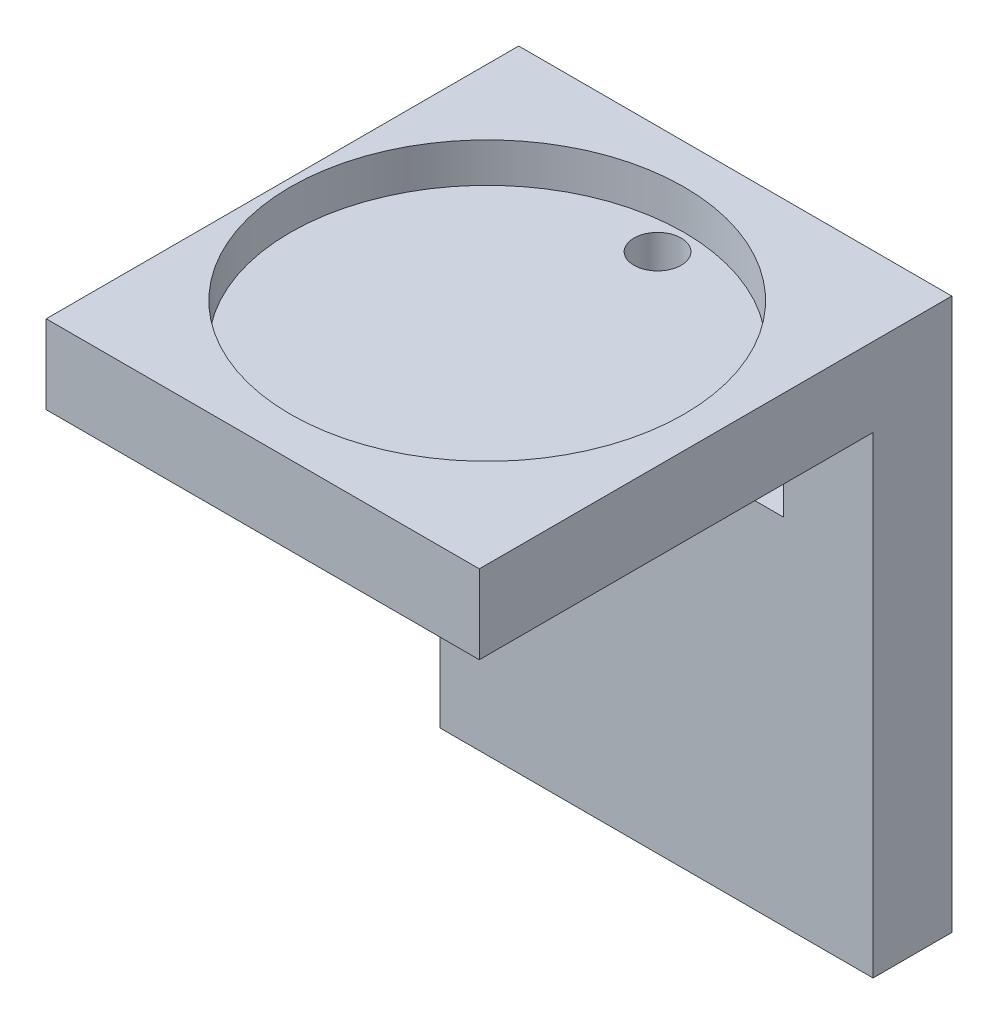
ISO-10303-21;
HEADER;
FILE_DESCRIPTION(('STEP AP214'),'2;1');
FILE_NAME('part.step','',(''),(''),'','','');
FILE_SCHEMA(('AUTOMOTIVE_DESIGN { 1 0 10303 214 1 1 1 1 }'));
ENDSEC;
DATA;
#1=APPLICATION_CONTEXT('core data for automotive mechanical design processes');
#2=APPLICATION_PROTOCOL_DEFINITION('international standard','automotive_design',2000,#1);
#3=PRODUCT_CONTEXT('',#1,'mechanical');
#4=PRODUCT('Part','Part','',(#3));
#5=PRODUCT_RELATED_PRODUCT_CATEGORY('part','',(#4));
#6=PRODUCT_DEFINITION_FORMATION('','',#4);
#7=PRODUCT_DEFINITION_CONTEXT('part definition',#1,'design');
#8=PRODUCT_DEFINITION('design','',#6,#7);
#9=PRODUCT_DEFINITION_SHAPE('','',#8);
#10=(LENGTH_UNIT() NAMED_UNIT(*) SI_UNIT(.MILLI.,.METRE.));
#11=(NAMED_UNIT(*) PLANE_ANGLE_UNIT() SI_UNIT($,.RADIAN.));
#12=(NAMED_UNIT(*) SI_UNIT($,.STERADIAN.) SOLID_ANGLE_UNIT());
#13=UNCERTAINTY_MEASURE_WITH_UNIT(LENGTH_MEASURE(1.E-05),#10,'distance_accuracy_value','');
#14=(GEOMETRIC_REPRESENTATION_CONTEXT(3) GLOBAL_UNCERTAINTY_ASSIGNED_CONTEXT((#13)) GLOBAL_UNIT_ASSIGNED_CONTEXT((#10,
#11,#12)) REPRESENTATION_CONTEXT('',''));
#15=CARTESIAN_POINT('',(0.,0.,0.));
#16=DIRECTION('',(0.,0.,1.));
#17=DIRECTION('',(1.,0.,0.));
#18=AXIS2_PLACEMENT_3D('',#15,#16,#17);
#19=CARTESIAN_POINT('',(0.,530.,0.));
#20=DIRECTION('',(0.,0.,-1.));
#21=DIRECTION('',(-1.,0.,0.));
#22=AXIS2_PLACEMENT_3D('',#19,#20,#21);
#23=PLANE('',#22);
#24=DIRECTION('',(-1.,0.,0.));
#25=VECTOR('',#24,1.);
#26=CARTESIAN_POINT('',(0.,280.,0.));
#27=LINE('',#26,#25);
#28=CARTESIAN_POINT('',(338.,280.,0.));
#29=VERTEX_POINT('',#28);
#30=CARTESIAN_POINT('',(228.,280.,0.));
#31=VERTEX_POINT('',#30);
#32=EDGE_CURVE('E173',#29,#31,#27,.T.);
#33=ORIENTED_EDGE('',*,*,#32,.T.);
#34=DIRECTION('',(0.,-1.,0.));
#35=VECTOR('',#34,1.);
#36=CARTESIAN_POINT('',(228.,0.,0.));
#37=LINE('',#36,#35);
#38=CARTESIAN_POINT('',(228.,260.,0.));
#39=VERTEX_POINT('',#38);
#40=EDGE_CURVE('E61',#31,#39,#37,.T.);
#41=ORIENTED_EDGE('',*,*,#40,.T.);
#42=DIRECTION('',(-1.,0.,0.));
#43=VECTOR('',#42,1.);
#44=CARTESIAN_POINT('',(9.99999999999982,260.,0.));
#45=LINE('',#44,#43);
#46=CARTESIAN_POINT('',(338.,260.,0.));
#47=VERTEX_POINT('',#46);
#48=EDGE_CURVE('E237',#47,#39,#45,.T.);
#49=ORIENTED_EDGE('',*,*,#48,.F.);
#50=DIRECTION('',(0.,1.,0.));
#51=VECTOR('',#50,1.);
#52=CARTESIAN_POINT('',(338.,0.,0.));
#53=LINE('',#52,#51);
#54=EDGE_CURVE('E463',#47,#29,#53,.T.);
#55=ORIENTED_EDGE('',*,*,#54,.T.);
#56=EDGE_LOOP('',(#33,#41,#49,#55));
#57=FACE_BOUND('',#56,.T.);
#58=ADVANCED_FACE('F38',(#57),#23,.F.);
#59=CARTESIAN_POINT('',(0.,530.,-120.));
#60=DIRECTION('',(0.,0.,1.));
#61=DIRECTION('',(1.,0.,0.));
#62=AXIS2_PLACEMENT_3D('',#59,#60,#61);
#63=PLANE('',#62);
#64=DIRECTION('',(0.,1.,0.));
#65=VECTOR('',#64,1.);
#66=CARTESIAN_POINT('',(315.198613037107,530.,-120.));
#67=LINE('',#66,#65);
#68=CARTESIAN_POINT('',(315.198613037107,230.,-120.));
#69=VERTEX_POINT('',#68);
#70=CARTESIAN_POINT('',(315.198613037107,260.,-120.));
#71=VERTEX_POINT('',#70);
#72=EDGE_CURVE('E210',#69,#71,#67,.T.);
#73=ORIENTED_EDGE('',*,*,#72,.T.);
#74=DIRECTION('',(-1.,0.,0.));
#75=VECTOR('',#74,1.);
#76=CARTESIAN_POINT('',(0.,260.,-120.));
#77=LINE('',#76,#75);
#78=CARTESIAN_POINT('',(295.198613037107,260.,-120.));
#79=VERTEX_POINT('',#78);
#80=EDGE_CURVE('E214',#71,#79,#77,.T.);
#81=ORIENTED_EDGE('',*,*,#80,.T.);
#82=DIRECTION('',(0.,-1.,0.));
#83=VECTOR('',#82,1.);
#84=CARTESIAN_POINT('',(295.198613037106,530.000000000001,-120.));
#85=LINE('',#84,#83);
#86=CARTESIAN_POINT('',(295.198613037107,230.,-120.));
#87=VERTEX_POINT('',#86);
#88=EDGE_CURVE('E194',#79,#87,#85,.T.);
#89=ORIENTED_EDGE('',*,*,#88,.T.);
#90=DIRECTION('',(1.,0.,0.));
#91=VECTOR('',#90,1.);
#92=CARTESIAN_POINT('',(0.,230.,-120.));
#93=LINE('',#92,#91);
#94=EDGE_CURVE('E206',#87,#69,#93,.T.);
#95=ORIENTED_EDGE('',*,*,#94,.T.);
#96=EDGE_LOOP('',(#73,#81,#89,#95));
#97=FACE_BOUND('',#96,.T.);
#98=DIRECTION('',(0.,-1.,0.));
#99=VECTOR('',#98,1.);
#100=CARTESIAN_POINT('',(338.,530.,-120.));
#101=LINE('',#100,#99);
#102=CARTESIAN_POINT('',(338.,280.,-120.));
#103=VERTEX_POINT('',#102);
#104=CARTESIAN_POINT('',(338.,140.,-120.));
#105=VERTEX_POINT('',#104);
#106=EDGE_CURVE('E142',#103,#105,#101,.T.);
#107=ORIENTED_EDGE('',*,*,#106,.T.);
#108=DIRECTION('',(-1.,0.,0.));
#109=VECTOR('',#108,1.);
#110=CARTESIAN_POINT('',(228.,140.,-120.));
#111=LINE('',#110,#109);
#112=CARTESIAN_POINT('',(228.,140.,-120.));
#113=VERTEX_POINT('',#112);
#114=EDGE_CURVE('E129',#105,#113,#111,.T.);
#115=ORIENTED_EDGE('',*,*,#114,.T.);
#116=DIRECTION('',(0.,1.,0.));
#117=VECTOR('',#116,1.);
#118=CARTESIAN_POINT('',(228.,530.,-120.));
#119=LINE('',#118,#117);
#120=CARTESIAN_POINT('',(228.,280.,-120.));
#121=VERTEX_POINT('',#120);
#122=EDGE_CURVE('E168',#113,#121,#119,.T.);
#123=ORIENTED_EDGE('',*,*,#122,.T.);
#124=DIRECTION('',(1.,0.,0.));
#125=VECTOR('',#124,1.);
#126=CARTESIAN_POINT('',(0.,280.,-120.));
#127=LINE('',#126,#125);
#128=EDGE_CURVE('E151',#121,#103,#127,.T.);
#129=ORIENTED_EDGE('',*,*,#128,.T.);
#130=EDGE_LOOP('',(#107,#115,#123,#129));
#131=FACE_BOUND('',#130,.T.);
#132=ADVANCED_FACE('F149',(#97,#131),#63,.F.);
#133=CARTESIAN_POINT('',(9.99999999999982,260.,-100.));
#134=DIRECTION('',(0.,1.,0.));
#135=DIRECTION('',(0.,0.,1.));
#136=AXIS2_PLACEMENT_3D('',#133,#134,#135);
#137=PLANE('',#136);
#138=ORIENTED_EDGE('',*,*,#48,.T.);
#139=DIRECTION('',(0.,0.,-1.));
#140=VECTOR('',#139,1.);
#141=CARTESIAN_POINT('',(228.,260.,-100.));
#142=LINE('',#141,#140);
#143=CARTESIAN_POINT('',(228.,260.,-100.));
#144=VERTEX_POINT('',#143);
#145=EDGE_CURVE('E159',#39,#144,#142,.T.);
#146=ORIENTED_EDGE('',*,*,#145,.T.);
#147=DIRECTION('',(-1.,0.,0.));
#148=VECTOR('',#147,1.);
#149=CARTESIAN_POINT('',(9.99999999999982,260.,-100.));
#150=LINE('',#149,#148);
#151=CARTESIAN_POINT('',(275.37180675401,260.,-100.));
#152=VERTEX_POINT('',#151);
#153=EDGE_CURVE('E243',#152,#144,#150,.T.);
#154=ORIENTED_EDGE('',*,*,#153,.F.);
#155=CARTESIAN_POINT('',(280.872267230736,260.,-102.39685930834));
#156=DIRECTION('',(0.,1.,0.));
#157=DIRECTION('',(0.,0.,1.));
#158=AXIS2_PLACEMENT_3D('',#155,#156,#157);
#159=CIRCLE('',#158,6.00000000000001);
#160=CARTESIAN_POINT('',(286.372727707462,260.,-100.));
#161=VERTEX_POINT('',#160);
#162=EDGE_CURVE('E225',#152,#161,#159,.T.);
#163=ORIENTED_EDGE('',*,*,#162,.T.);
#164=CARTESIAN_POINT('',(295.198613037107,260.,-100.));
#165=VERTEX_POINT('',#164);
#166=EDGE_CURVE('E242',#165,#161,#150,.T.);
#167=ORIENTED_EDGE('',*,*,#166,.F.);
#168=DIRECTION('',(0.,0.,1.));
#169=VECTOR('',#168,1.);
#170=CARTESIAN_POINT('',(295.198613037107,260.,-180.));
#171=LINE('',#170,#169);
#172=EDGE_CURVE('E189',#79,#165,#171,.T.);
#173=ORIENTED_EDGE('',*,*,#172,.F.);
#174=ORIENTED_EDGE('',*,*,#80,.F.);
#175=DIRECTION('',(0.,0.,1.));
#176=VECTOR('',#175,1.);
#177=CARTESIAN_POINT('',(315.198613037107,260.,-180.));
#178=LINE('',#177,#176);
#179=CARTESIAN_POINT('',(315.198613037107,260.,-100.));
#180=VERTEX_POINT('',#179);
#181=EDGE_CURVE('E190',#71,#180,#178,.T.);
#182=ORIENTED_EDGE('',*,*,#181,.T.);
#183=CARTESIAN_POINT('',(338.,260.,-100.));
#184=VERTEX_POINT('',#183);
#185=EDGE_CURVE('E238',#184,#180,#150,.T.);
#186=ORIENTED_EDGE('',*,*,#185,.F.);
#187=DIRECTION('',(0.,0.,1.));
#188=VECTOR('',#187,1.);
#189=CARTESIAN_POINT('',(338.,260.,-100.));
#190=LINE('',#189,#188);
#191=EDGE_CURVE('E154',#184,#47,#190,.T.);
#192=ORIENTED_EDGE('',*,*,#191,.T.);
#193=EDGE_LOOP('',(#138,#146,#154,#163,#167,#173,#174,#182,#186,#192));
#194=FACE_BOUND('',#193,.T.);
#195=ADVANCED_FACE('F265',(#194),#137,.F.);
#196=CARTESIAN_POINT('',(0.,0.,-100.));
#197=DIRECTION('',(0.,0.,-1.));
#198=DIRECTION('',(-1.,0.,0.));
#199=AXIS2_PLACEMENT_3D('',#196,#197,#198);
#200=PLANE('',#199);
#201=DIRECTION('',(0.,-1.,0.));
#202=VECTOR('',#201,1.);
#203=CARTESIAN_POINT('',(228.,0.,-100.));
#204=LINE('',#203,#202);
#205=CARTESIAN_POINT('',(228.,140.,-100.));
#206=VERTEX_POINT('',#205);
#207=EDGE_CURVE('E153',#144,#206,#204,.T.);
#208=ORIENTED_EDGE('',*,*,#207,.T.);
#209=DIRECTION('',(1.,0.,0.));
#210=VECTOR('',#209,1.);
#211=CARTESIAN_POINT('',(0.,140.,-100.));
#212=LINE('',#211,#210);
#213=CARTESIAN_POINT('',(338.,140.,-100.));
#214=VERTEX_POINT('',#213);
#215=EDGE_CURVE('E53',#206,#214,#212,.T.);
#216=ORIENTED_EDGE('',*,*,#215,.T.);
#217=DIRECTION('',(0.,1.,0.));
#218=VECTOR('',#217,1.);
#219=CARTESIAN_POINT('',(338.,0.,-100.));
#220=LINE('',#219,#218);
#221=EDGE_CURVE('E145',#214,#184,#220,.T.);
#222=ORIENTED_EDGE('',*,*,#221,.T.);
#223=ORIENTED_EDGE('',*,*,#185,.T.);
#224=DIRECTION('',(0.,1.,0.));
#225=VECTOR('',#224,1.);
#226=CARTESIAN_POINT('',(315.198613037107,260.,-100.));
#227=LINE('',#226,#225);
#228=CARTESIAN_POINT('',(315.198613037107,230.,-100.));
#229=VERTEX_POINT('',#228);
#230=EDGE_CURVE('E185',#229,#180,#227,.T.);
#231=ORIENTED_EDGE('',*,*,#230,.F.);
#232=DIRECTION('',(1.,0.,0.));
#233=VECTOR('',#232,1.);
#234=CARTESIAN_POINT('',(295.198613037107,230.,-100.));
#235=LINE('',#234,#233);
#236=CARTESIAN_POINT('',(295.198613037107,230.,-100.));
#237=VERTEX_POINT('',#236);
#238=EDGE_CURVE('E181',#237,#229,#235,.T.);
#239=ORIENTED_EDGE('',*,*,#238,.F.);
#240=DIRECTION('',(0.,-1.,0.));
#241=VECTOR('',#240,1.);
#242=CARTESIAN_POINT('',(295.198613037107,260.,-100.));
#243=LINE('',#242,#241);
#244=EDGE_CURVE('E177',#165,#237,#243,.T.);
#245=ORIENTED_EDGE('',*,*,#244,.F.);
#246=ORIENTED_EDGE('',*,*,#166,.T.);
#247=DIRECTION('',(0.,1.,0.));
#248=VECTOR('',#247,1.);
#249=CARTESIAN_POINT('',(286.372727707462,270.,-100.));
#250=LINE('',#249,#248);
#251=CARTESIAN_POINT('',(286.372727707462,240.,-100.));
#252=VERTEX_POINT('',#251);
#253=EDGE_CURVE('E46',#161,#252,#250,.F.);
#254=ORIENTED_EDGE('',*,*,#253,.T.);
#255=CARTESIAN_POINT('',(250.057373032601,254.966218559328,-100.));
#256=CARTESIAN_POINT('',(251.140258551637,254.317531167906,-100.));
#257=CARTESIAN_POINT('',(252.223221070437,253.668972190644,-100.));
#258=CARTESIAN_POINT('',(254.3894359211,252.372262171833,-100.));
#259=CARTESIAN_POINT('',(255.47268826091,251.72411114356,-100.));
#260=CARTESIAN_POINT('',(257.640408959581,250.427895606072,-100.));
#261=CARTESIAN_POINT('',(258.724877602281,249.779831571409,-100.));
#262=CARTESIAN_POINT('',(260.89433462884,248.484648435802,-100.));
#263=CARTESIAN_POINT('',(261.979322996011,247.837529306908,-100.));
#264=CARTESIAN_POINT('',(264.13229928307,246.55543634891,-100.));
#265=CARTESIAN_POINT('',(265.200272666179,245.92043813214,-100.));
#266=CARTESIAN_POINT('',(266.803450862651,244.969881995614,-100.));
#267=CARTESIAN_POINT('',(267.338071391517,244.653338873332,-100.));
#268=CARTESIAN_POINT('',(268.407863236272,244.021194544962,-100.));
#269=CARTESIAN_POINT('',(268.943034547424,243.70559333086,-100.));
#270=CARTESIAN_POINT('',(270.013915293355,243.075925461693,-100.));
#271=CARTESIAN_POINT('',(270.549624319184,242.761858111353,-100.));
#272=CARTESIAN_POINT('',(271.62229303155,242.135820570501,-100.));
#273=CARTESIAN_POINT('',(272.159252758841,241.823850449652,-100.));
#274=CARTESIAN_POINT('',(272.966190602009,241.358591278576,-100.));
#275=CARTESIAN_POINT('',(273.23539812658,241.20396641087,-100.));
#276=CARTESIAN_POINT('',(273.774504289856,240.89592695451,-100.));
#277=CARTESIAN_POINT('',(274.044402925955,240.742512361301,-100.));
#278=CARTESIAN_POINT('',(274.58512703791,240.43735812052,-100.));
#279=CARTESIAN_POINT('',(274.855952462914,240.285618382921,-100.));
#280=CARTESIAN_POINT('',(275.398920522409,239.984516940515,-100.));
#281=CARTESIAN_POINT('',(275.671063130298,239.83515518794,-100.));
#282=CARTESIAN_POINT('',(276.056608683869,239.626836510288,-100.));
#283=CARTESIAN_POINT('',(276.169206720112,239.566390041173,-100.));
#284=CARTESIAN_POINT('',(276.394797169667,239.446234409891,-100.));
#285=CARTESIAN_POINT('',(276.507789586299,239.386525253949,-100.));
#286=CARTESIAN_POINT('',(276.734261602729,239.267988968544,-100.));
#287=CARTESIAN_POINT('',(276.847741283467,239.209161993535,-100.));
#288=CARTESIAN_POINT('',(277.075262004951,239.092603250821,-100.));
#289=CARTESIAN_POINT('',(277.189303043325,239.034871478492,-100.));
#290=CARTESIAN_POINT('',(277.418992968411,238.92030296651,-100.));
#291=CARTESIAN_POINT('',(277.534647391537,238.863477301686,-100.));
#292=CARTESIAN_POINT('',(277.766794200456,238.751565602456,-100.));
#293=CARTESIAN_POINT('',(277.883286568651,238.696479531645,-100.));
#294=CARTESIAN_POINT('',(278.117277289716,238.5885355447,-100.));
#295=CARTESIAN_POINT('',(278.234775451232,238.535677215591,-100.));
#296=CARTESIAN_POINT('',(278.471018410916,238.432834955452,-100.));
#297=CARTESIAN_POINT('',(278.589763118924,238.38285081821,-100.));
#298=CARTESIAN_POINT('',(278.848900251733,238.278529663648,-100.));
#299=CARTESIAN_POINT('',(278.989571243624,238.224876745314,-100.));
#300=CARTESIAN_POINT('',(279.273471013461,238.124636444603,-100.));
#301=CARTESIAN_POINT('',(279.416700111458,238.078049953341,-100.));
#302=CARTESIAN_POINT('',(279.704068633366,237.99519707264,-100.));
#303=CARTESIAN_POINT('',(279.848169410487,237.958799371518,-100.));
#304=CARTESIAN_POINT('',(280.139047084348,237.898671494034,-100.));
#305=CARTESIAN_POINT('',(280.285822772019,237.874935734421,-100.));
#306=CARTESIAN_POINT('',(280.508823937424,237.850791045678,-100.));
#307=CARTESIAN_POINT('',(280.584448159108,237.84465101016,-100.));
#308=CARTESIAN_POINT('',(280.735928127132,237.836631582644,-100.));
#309=CARTESIAN_POINT('',(280.81178387002,237.834752127429,-100.));
#310=CARTESIAN_POINT('',(280.963467417019,237.835336311266,-100.));
#311=CARTESIAN_POINT('',(281.03929522362,237.837799293085,-100.));
#312=CARTESIAN_POINT('',(281.190686753359,237.846961501393,-100.));
#313=CARTESIAN_POINT('',(281.266250470688,237.853660820472,-100.));
#314=CARTESIAN_POINT('',(281.494108705574,237.879981604408,-100.));
#315=CARTESIAN_POINT('',(281.645717378416,237.90581035649,-100.));
#316=CARTESIAN_POINT('',(281.870900477754,237.954442706146,-100.));
#317=CARTESIAN_POINT('',(281.945622539874,237.972311826153,-100.));
#318=CARTESIAN_POINT('',(282.094329897512,238.010904234452,-100.));
#319=CARTESIAN_POINT('',(282.168315216974,238.031627429663,-100.));
#320=CARTESIAN_POINT('',(282.348703442663,238.08540098262,-100.));
#321=CARTESIAN_POINT('',(282.454701998813,238.119800221294,-100.));
#322=CARTESIAN_POINT('',(282.665304799223,238.192655781165,-100.));
#323=CARTESIAN_POINT('',(282.769908737414,238.231112976954,-100.));
#324=CARTESIAN_POINT('',(282.977963264141,238.3112432195,-100.));
#325=CARTESIAN_POINT('',(283.081412894337,238.352918739439,-100.));
#326=CARTESIAN_POINT('',(283.287262873885,238.438793236237,-100.));
#327=CARTESIAN_POINT('',(283.389663139611,238.482992412391,-100.));
#328=CARTESIAN_POINT('',(283.696048233998,238.618791859949,-100.));
#329=CARTESIAN_POINT('',(283.898702013421,238.713389268428,-100.));
#330=CARTESIAN_POINT('',(284.301410265965,238.907674341732,-100.));
#331=CARTESIAN_POINT('',(284.501465846349,239.007359742546,-100.));
#332=CARTESIAN_POINT('',(284.901948156154,239.211319548991,-100.));
#333=CARTESIAN_POINT('',(285.102355482036,239.315631936253,-100.));
#334=CARTESIAN_POINT('',(285.501866046031,239.526762089944,-100.));
#335=CARTESIAN_POINT('',(285.700969152675,239.633580104125,-100.));
#336=CARTESIAN_POINT('',(286.097819648206,239.848821255805,-100.));
#337=CARTESIAN_POINT('',(286.295568882363,239.957240997379,-100.));
#338=CARTESIAN_POINT('',(286.690315156723,240.175422287943,-100.));
#339=CARTESIAN_POINT('',(286.887312223891,240.285183788229,-100.));
#340=CARTESIAN_POINT('',(287.482217687487,240.618661423922,-100.));
#341=CARTESIAN_POINT('',(287.879245253834,240.843947763216,-100.));
#342=CARTESIAN_POINT('',(288.671852601172,241.297055462725,-100.));
#343=CARTESIAN_POINT('',(289.067432363747,241.524876855038,-100.));
#344=CARTESIAN_POINT('',(289.857635799905,241.982210274055,-100.));
#345=CARTESIAN_POINT('',(290.252259431104,242.211722373945,-100.));
#346=CARTESIAN_POINT('',(291.040826863209,242.671912027382,-100.));
#347=CARTESIAN_POINT('',(291.434770662826,242.902589583137,-100.));
#348=CARTESIAN_POINT('',(292.616605719139,243.596287510253,-100.));
#349=CARTESIAN_POINT('',(293.403768921447,244.060547763994,-100.));
#350=CARTESIAN_POINT('',(294.976983942671,244.990902886224,-100.));
#351=CARTESIAN_POINT('',(295.763035786993,245.456997711821,-100.));
#352=CARTESIAN_POINT('',(297.285783142206,246.361446926795,-100.));
#353=CARTESIAN_POINT('',(298.022520167697,246.799731432069,-100.));
#354=CARTESIAN_POINT('',(299.495585616799,247.676999023405,-100.));
#355=CARTESIAN_POINT('',(300.231914037262,248.115982114749,-100.));
#356=CARTESIAN_POINT('',(301.70353577594,248.993997496367,-100.));
#357=CARTESIAN_POINT('',(302.438829389615,249.433029291502,-100.));
#358=CARTESIAN_POINT('',(303.909190154444,250.311458389767,-100.));
#359=CARTESIAN_POINT('',(304.64425730739,250.750855689895,-100.));
#360=CARTESIAN_POINT('',(305.37925039018,251.190376707559,-100.));
#361=B_SPLINE_CURVE_WITH_KNOTS('',3,(#255,#256,#257,#258,#259,#260,#261,#262,#263,#264,#265,
#266,#267,#268,#269,#270,#271,#272,#273,#274,#275,#276,#277,#278,#279,#280,#281,#282,#283,#284,
#285,#286,#287,#288,#289,#290,#291,#292,#293,#294,#295,#296,#297,#298,#299,#300,#301,#302,#303,
#304,#305,#306,#307,#308,#309,#310,#311,#312,#313,#314,#315,#316,#317,#318,#319,#320,#321,#322,
#323,#324,#325,#326,#327,#328,#329,#330,#331,#332,#333,#334,#335,#336,#337,#338,#339,#340,#341,
#342,#343,#344,#345,#346,#347,#348,#349,#350,#351,#352,#353,#354,#355,#356,#357,#358,#359,#360),
.UNSPECIFIED.,.F.,.F.,(4,2,2,2,2,2,2,2,2,2,2,2,2,2,2,2,2,2,2,2,2,2,2,2,2,2,2,2,2,2,2,2,2,2,2,2,
2,2,2,2,2,2,2,2,2,2,2,2,2,2,2,2,4),(0.,3.78694177954998,7.57400102749179,11.364057818296,
15.1540001374908,18.8814777990944,20.745389203155,22.6092847047757,24.4722377006268,
26.3352522756227,27.266611463567,28.1979671443606,29.1292725166091,30.0605591573071,
30.4439482822352,30.8273406422608,31.2107993619032,31.5942564621989,31.9808273709538,
32.3673901846904,32.7538810200593,33.1403440913971,33.5918765769845,34.0434659560346,
34.4889349179719,34.9342072887892,35.1617221992656,35.3892337338556,35.6167108372552,
35.844192912658,36.3046862467581,36.5351376456274,36.765581530383,37.0997941584304,
37.4340789654711,37.7686232665513,38.1031940235843,38.7739978205361,39.4445056878835,
40.1222681769323,40.8000979667708,41.4766531817596,42.1531839112881,43.5226411829755,
44.892115814509,46.261650080047,47.6311869390695,50.3727997532277,53.1143488447303,
55.6860933055013,58.2578573000388,60.8270303005566,63.3961824068603),.UNSPECIFIED.);
#362=CARTESIAN_POINT('',(275.37180675401,240.,-100.));
#363=VERTEX_POINT('',#362);
#364=EDGE_CURVE('E241',#252,#363,#361,.F.);
#365=ORIENTED_EDGE('',*,*,#364,.T.);
#366=DIRECTION('',(0.,1.,0.));
#367=VECTOR('',#366,1.);
#368=CARTESIAN_POINT('',(275.37180675401,270.,-100.));
#369=LINE('',#368,#367);
#370=EDGE_CURVE('E11',#363,#152,#369,.T.);
#371=ORIENTED_EDGE('',*,*,#370,.T.);
#372=ORIENTED_EDGE('',*,*,#153,.T.);
#373=EDGE_LOOP('',(#208,#216,#222,#223,#231,#239,#245,#246,#254,#365,#371,#372));
#374=FACE_BOUND('',#373,.T.);
#375=ADVANCED_FACE('F259',(#374),#200,.F.);
#376=CARTESIAN_POINT('',(340.,280.,-100.));
#377=DIRECTION('',(0.,-1.,0.));
#378=DIRECTION('',(0.,0.,-1.));
#379=AXIS2_PLACEMENT_3D('',#376,#377,#378);
#380=PLANE('',#379);
#381=CARTESIAN_POINT('',(280.,280.,-60.));
#382=DIRECTION('',(0.,-1.,0.));
#383=DIRECTION('',(0.,0.,-1.));
#384=AXIS2_PLACEMENT_3D('',#381,#382,#383);
#385=CIRCLE('',#384,50.);
#386=CARTESIAN_POINT('',(280.,280.,-110.));
#387=VERTEX_POINT('',#386);
#388=EDGE_CURVE('E233',#387,#387,#385,.T.);
#389=ORIENTED_EDGE('',*,*,#388,.T.);
#390=EDGE_LOOP('',(#389));
#391=FACE_BOUND('',#390,.T.);
#392=ORIENTED_EDGE('',*,*,#128,.F.);
#393=DIRECTION('',(0.,0.,-1.));
#394=VECTOR('',#393,1.);
#395=CARTESIAN_POINT('',(228.,280.,0.));
#396=LINE('',#395,#394);
#397=EDGE_CURVE('E459',#31,#121,#396,.T.);
#398=ORIENTED_EDGE('',*,*,#397,.F.);
#399=ORIENTED_EDGE('',*,*,#32,.F.);
#400=DIRECTION('',(0.,0.,-1.));
#401=VECTOR('',#400,1.);
#402=CARTESIAN_POINT('',(338.,280.,0.));
#403=LINE('',#402,#401);
#404=EDGE_CURVE('E460',#29,#103,#403,.T.);
#405=ORIENTED_EDGE('',*,*,#404,.T.);
#406=EDGE_LOOP('',(#392,#398,#399,#405));
#407=FACE_BOUND('',#406,.T.);
#408=ADVANCED_FACE('F264',(#391,#407),#380,.F.);
#409=CARTESIAN_POINT('',(280.,270.,-60.));
#410=DIRECTION('',(0.,1.,0.));
#411=DIRECTION('',(0.,0.,1.));
#412=AXIS2_PLACEMENT_3D('',#409,#410,#411);
#413=CYLINDRICAL_SURFACE('',#412,50.);
#414=CARTESIAN_POINT('',(280.,270.,-60.));
#415=DIRECTION('',(0.,1.,0.));
#416=DIRECTION('',(0.,0.,1.));
#417=AXIS2_PLACEMENT_3D('',#414,#415,#416);
#418=CIRCLE('',#417,50.);
#419=CARTESIAN_POINT('',(280.,270.,-9.99999999999997));
#420=VERTEX_POINT('',#419);
#421=EDGE_CURVE('E229',#420,#420,#418,.T.);
#422=ORIENTED_EDGE('',*,*,#421,.F.);
#423=EDGE_LOOP('',(#422));
#424=FACE_BOUND('',#423,.T.);
#425=ORIENTED_EDGE('',*,*,#388,.F.);
#426=EDGE_LOOP('',(#425));
#427=FACE_BOUND('',#426,.T.);
#428=ADVANCED_FACE('F316',(#424,#427),#413,.F.);
#429=CARTESIAN_POINT('',(280.,270.,-60.));
#430=DIRECTION('',(0.,1.,0.));
#431=DIRECTION('',(0.,0.,1.));
#432=AXIS2_PLACEMENT_3D('',#429,#430,#431);
#433=PLANE('',#432);
#434=CARTESIAN_POINT('',(280.872267230736,270.,-102.39685930834));
#435=DIRECTION('',(0.,1.,0.));
#436=DIRECTION('',(0.,0.,1.));
#437=AXIS2_PLACEMENT_3D('',#434,#435,#436);
#438=CIRCLE('',#437,6.00000000000001);
#439=CARTESIAN_POINT('',(280.872267230736,270.,-96.3968593083399));
#440=VERTEX_POINT('',#439);
#441=EDGE_CURVE('E218',#440,#440,#438,.T.);
#442=ORIENTED_EDGE('',*,*,#441,.F.);
#443=EDGE_LOOP('',(#442));
#444=FACE_BOUND('',#443,.T.);
#445=ORIENTED_EDGE('',*,*,#421,.T.);
#446=EDGE_LOOP('',(#445));
#447=FACE_BOUND('',#446,.T.);
#448=ADVANCED_FACE('F311',(#444,#447),#433,.T.);
#449=CARTESIAN_POINT('',(280.872267230736,270.,-102.39685930834));
#450=DIRECTION('',(0.,1.,0.));
#451=DIRECTION('',(0.,0.,1.));
#452=AXIS2_PLACEMENT_3D('',#449,#450,#451);
#453=CYLINDRICAL_SURFACE('',#452,6.00000000000001);
#454=ORIENTED_EDGE('',*,*,#441,.T.);
#455=EDGE_LOOP('',(#454));
#456=FACE_BOUND('',#455,.T.);
#457=CARTESIAN_POINT('',(280.872267230736,240.,-102.39685930834));
#458=DIRECTION('',(0.,1.,0.));
#459=DIRECTION('',(0.,0.,1.));
#460=AXIS2_PLACEMENT_3D('',#457,#458,#459);
#461=CIRCLE('',#460,6.00000000000001);
#462=EDGE_CURVE('E222',#252,#363,#461,.T.);
#463=ORIENTED_EDGE('',*,*,#462,.F.);
#464=ORIENTED_EDGE('',*,*,#253,.F.);
#465=ORIENTED_EDGE('',*,*,#162,.F.);
#466=ORIENTED_EDGE('',*,*,#370,.F.);
#467=EDGE_LOOP('',(#463,#464,#465,#466));
#468=FACE_BOUND('',#467,.T.);
#469=ADVANCED_FACE('F297',(#456,#468),#453,.F.);
#470=CARTESIAN_POINT('',(280.872267230736,240.,-102.39685930834));
#471=DIRECTION('',(0.,1.,0.));
#472=DIRECTION('',(0.,0.,1.));
#473=AXIS2_PLACEMENT_3D('',#470,#471,#472);
#474=CONICAL_SURFACE('',#473,6.00000000000001,1.02974425867666);
#475=CARTESIAN_POINT('',(280.872267230736,236.394836285835,-102.39685930834));
#476=VERTEX_POINT('',#475);
#477=VERTEX_LOOP('',#476);
#478=FACE_BOUND('',#477,.T.);
#479=ORIENTED_EDGE('',*,*,#462,.T.);
#480=ORIENTED_EDGE('',*,*,#364,.F.);
#481=EDGE_LOOP('',(#479,#480));
#482=FACE_BOUND('',#481,.T.);
#483=ADVANCED_FACE('F255',(#478,#482),#474,.F.);
#484=CARTESIAN_POINT('',(315.198613037107,260.,-180.));
#485=DIRECTION('',(1.,0.,0.));
#486=DIRECTION('',(0.,0.,-1.));
#487=AXIS2_PLACEMENT_3D('',#484,#485,#486);
#488=PLANE('',#487);
#489=DIRECTION('',(0.,0.,1.));
#490=VECTOR('',#489,1.);
#491=CARTESIAN_POINT('',(315.198613037107,230.,-180.));
#492=LINE('',#491,#490);
#493=EDGE_CURVE('E195',#69,#229,#492,.T.);
#494=ORIENTED_EDGE('',*,*,#493,.T.);
#495=ORIENTED_EDGE('',*,*,#230,.T.);
#496=ORIENTED_EDGE('',*,*,#181,.F.);
#497=ORIENTED_EDGE('',*,*,#72,.F.);
#498=EDGE_LOOP('',(#494,#495,#496,#497));
#499=FACE_BOUND('',#498,.T.);
#500=ADVANCED_FACE('F281',(#499),#488,.F.);
#501=CARTESIAN_POINT('',(295.198613037107,230.,-180.));
#502=DIRECTION('',(0.,-1.,0.));
#503=DIRECTION('',(0.,0.,-1.));
#504=AXIS2_PLACEMENT_3D('',#501,#502,#503);
#505=PLANE('',#504);
#506=DIRECTION('',(0.,0.,1.));
#507=VECTOR('',#506,1.);
#508=CARTESIAN_POINT('',(295.198613037107,230.,-180.));
#509=LINE('',#508,#507);
#510=EDGE_CURVE('E198',#87,#237,#509,.T.);
#511=ORIENTED_EDGE('',*,*,#510,.T.);
#512=ORIENTED_EDGE('',*,*,#238,.T.);
#513=ORIENTED_EDGE('',*,*,#493,.F.);
#514=ORIENTED_EDGE('',*,*,#94,.F.);
#515=EDGE_LOOP('',(#511,#512,#513,#514));
#516=FACE_BOUND('',#515,.T.);
#517=ADVANCED_FACE('F283',(#516),#505,.F.);
#518=CARTESIAN_POINT('',(295.198613037107,260.,-180.));
#519=DIRECTION('',(-1.,0.,0.));
#520=DIRECTION('',(0.,-1.,0.));
#521=AXIS2_PLACEMENT_3D('',#518,#519,#520);
#522=PLANE('',#521);
#523=ORIENTED_EDGE('',*,*,#172,.T.);
#524=ORIENTED_EDGE('',*,*,#244,.T.);
#525=ORIENTED_EDGE('',*,*,#510,.F.);
#526=ORIENTED_EDGE('',*,*,#88,.F.);
#527=EDGE_LOOP('',(#523,#524,#525,#526));
#528=FACE_BOUND('',#527,.T.);
#529=ADVANCED_FACE('F291',(#528),#522,.F.);
#530=CARTESIAN_POINT('',(338.,0.,0.));
#531=DIRECTION('',(-1.,0.,0.));
#532=DIRECTION('',(0.,0.,1.));
#533=AXIS2_PLACEMENT_3D('',#530,#531,#532);
#534=PLANE('',#533);
#535=ORIENTED_EDGE('',*,*,#221,.F.);
#536=DIRECTION('',(0.,0.,1.));
#537=VECTOR('',#536,1.);
#538=CARTESIAN_POINT('',(338.,140.,-120.));
#539=LINE('',#538,#537);
#540=EDGE_CURVE('E132',#105,#214,#539,.T.);
#541=ORIENTED_EDGE('',*,*,#540,.F.);
#542=ORIENTED_EDGE('',*,*,#106,.F.);
#543=ORIENTED_EDGE('',*,*,#404,.F.);
#544=ORIENTED_EDGE('',*,*,#54,.F.);
#545=ORIENTED_EDGE('',*,*,#191,.F.);
#546=EDGE_LOOP('',(#535,#541,#542,#543,#544,#545));
#547=FACE_BOUND('',#546,.T.);
#548=ADVANCED_FACE('F141',(#547),#534,.F.);
#549=CARTESIAN_POINT('',(228.,0.,0.));
#550=DIRECTION('',(1.,0.,0.));
#551=DIRECTION('',(0.,0.,-1.));
#552=AXIS2_PLACEMENT_3D('',#549,#550,#551);
#553=PLANE('',#552);
#554=ORIENTED_EDGE('',*,*,#122,.F.);
#555=DIRECTION('',(0.,0.,1.));
#556=VECTOR('',#555,1.);
#557=CARTESIAN_POINT('',(228.,140.,-120.));
#558=LINE('',#557,#556);
#559=EDGE_CURVE('E133',#113,#206,#558,.T.);
#560=ORIENTED_EDGE('',*,*,#559,.T.);
#561=ORIENTED_EDGE('',*,*,#207,.F.);
#562=ORIENTED_EDGE('',*,*,#145,.F.);
#563=ORIENTED_EDGE('',*,*,#40,.F.);
#564=ORIENTED_EDGE('',*,*,#397,.T.);
#565=EDGE_LOOP('',(#554,#560,#561,#562,#563,#564));
#566=FACE_BOUND('',#565,.T.);
#567=ADVANCED_FACE('F325',(#566),#553,.F.);
#568=CARTESIAN_POINT('',(228.,140.,-120.));
#569=DIRECTION('',(0.,1.,0.));
#570=DIRECTION('',(0.,0.,1.));
#571=AXIS2_PLACEMENT_3D('',#568,#569,#570);
#572=PLANE('',#571);
#573=ORIENTED_EDGE('',*,*,#559,.F.);
#574=ORIENTED_EDGE('',*,*,#114,.F.);
#575=ORIENTED_EDGE('',*,*,#540,.T.);
#576=ORIENTED_EDGE('',*,*,#215,.F.);
#577=EDGE_LOOP('',(#573,#574,#575,#576));
#578=FACE_BOUND('',#577,.T.);
#579=ADVANCED_FACE('F131',(#578),#572,.F.);
#580=CLOSED_SHELL('',(#58,#132,#195,#375,#408,#428,#448,#469,#483,#500,#517,#529,#548,#567,#579));
#581=MANIFOLD_SOLID_BREP('B2',#580);
#582=ADVANCED_BREP_SHAPE_REPRESENTATION('',(#18,#581),#14);
#583=SHAPE_DEFINITION_REPRESENTATION(#9,#582);
ENDSEC;
END-ISO-10303-21;
